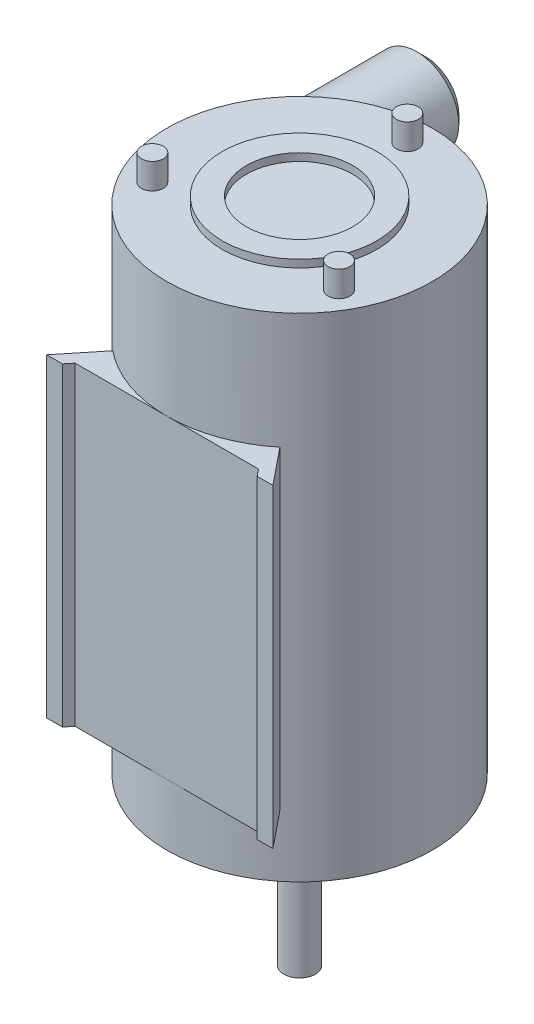
ISO-10303-21;
HEADER;
FILE_DESCRIPTION(('STEP AP214'),'2;1');
FILE_NAME('part.step','',(''),(''),'','','');
FILE_SCHEMA(('AUTOMOTIVE_DESIGN { 1 0 10303 214 1 1 1 1 }'));
ENDSEC;
DATA;
#1=APPLICATION_CONTEXT('core data for automotive mechanical design processes');
#2=APPLICATION_PROTOCOL_DEFINITION('international standard','automotive_design',2000,#1);
#3=PRODUCT_CONTEXT('',#1,'mechanical');
#4=PRODUCT('Part','Part','',(#3));
#5=PRODUCT_RELATED_PRODUCT_CATEGORY('part','',(#4));
#6=PRODUCT_DEFINITION_FORMATION('','',#4);
#7=PRODUCT_DEFINITION_CONTEXT('part definition',#1,'design');
#8=PRODUCT_DEFINITION('design','',#6,#7);
#9=PRODUCT_DEFINITION_SHAPE('','',#8);
#10=(LENGTH_UNIT() NAMED_UNIT(*) SI_UNIT(.MILLI.,.METRE.));
#11=(NAMED_UNIT(*) PLANE_ANGLE_UNIT() SI_UNIT($,.RADIAN.));
#12=(NAMED_UNIT(*) SI_UNIT($,.STERADIAN.) SOLID_ANGLE_UNIT());
#13=UNCERTAINTY_MEASURE_WITH_UNIT(LENGTH_MEASURE(1.E-05),#10,'distance_accuracy_value','');
#14=(GEOMETRIC_REPRESENTATION_CONTEXT(3) GLOBAL_UNCERTAINTY_ASSIGNED_CONTEXT((#13)) GLOBAL_UNIT_ASSIGNED_CONTEXT((#10,
#11,#12)) REPRESENTATION_CONTEXT('',''));
#15=CARTESIAN_POINT('',(0.,0.,0.));
#16=DIRECTION('',(0.,0.,1.));
#17=DIRECTION('',(1.,0.,0.));
#18=AXIS2_PLACEMENT_3D('',#15,#16,#17);
#19=CARTESIAN_POINT('',(0.,42.9514,0.));
#20=DIRECTION('',(0.,-1.,0.));
#21=DIRECTION('',(0.,0.,-1.));
#22=AXIS2_PLACEMENT_3D('',#19,#20,#21);
#23=CYLINDRICAL_SURFACE('',#22,11.5824);
#24=CARTESIAN_POINT('',(0.,0.,0.));
#25=DIRECTION('',(0.,1.,0.));
#26=DIRECTION('',(0.,0.,1.));
#27=AXIS2_PLACEMENT_3D('',#24,#25,#26);
#28=CIRCLE('',#27,11.5824);
#29=CARTESIAN_POINT('',(0.,0.,11.5824));
#30=VERTEX_POINT('',#29);
#31=EDGE_CURVE('E215',#30,#30,#28,.T.);
#32=ORIENTED_EDGE('',*,*,#31,.T.);
#33=EDGE_LOOP('',(#32));
#34=FACE_BOUND('',#33,.T.);
#35=CARTESIAN_POINT('',(0.,42.9514,0.));
#36=DIRECTION('',(0.,1.,0.));
#37=DIRECTION('',(0.,0.,1.));
#38=AXIS2_PLACEMENT_3D('',#35,#36,#37);
#39=CIRCLE('',#38,11.5824);
#40=CARTESIAN_POINT('',(0.,42.9514,11.5824));
#41=VERTEX_POINT('',#40);
#42=EDGE_CURVE('E218',#41,#41,#39,.T.);
#43=ORIENTED_EDGE('',*,*,#42,.F.);
#44=EDGE_LOOP('',(#43));
#45=FACE_BOUND('',#44,.T.);
#46=CARTESIAN_POINT('',(-11.5824,37.8333,0.));
#47=CARTESIAN_POINT('',(-11.5824,37.8331410786259,-3.20483130011963E-08));
#48=CARTESIAN_POINT('',(-11.5823999896922,37.8329821574103,-0.000467474998459455));
#49=CARTESIAN_POINT('',(-11.5823999328128,37.8325434634291,-0.00151313843494728));
#50=CARTESIAN_POINT('',(-11.5823998646313,37.8322636561148,-0.00190545675784335));
#51=CARTESIAN_POINT('',(-11.5823994862447,37.8312069866466,-0.00353191152183258));
#52=CARTESIAN_POINT('',(-11.5823989612629,37.8304309649032,-0.00502251146221884));
#53=CARTESIAN_POINT('',(-11.5823959007933,37.8273515794137,-0.0107869069694098));
#54=CARTESIAN_POINT('',(-11.5823914418426,37.8250464647481,-0.0147679166288982));
#55=CARTESIAN_POINT('',(-11.5822288004094,37.76849372382,-0.112627852863299));
#56=CARTESIAN_POINT('',(-11.5808707872837,37.7142720480142,-0.210776622957327));
#57=CARTESIAN_POINT('',(-11.5757170957593,37.6052015608214,-0.405996049577173));
#58=CARTESIAN_POINT('',(-11.5718907833348,37.5503534974678,-0.503037339912126));
#59=CARTESIAN_POINT('',(-11.5619524357871,37.4428013702579,-0.694161523822879));
#60=CARTESIAN_POINT('',(-11.5559288140794,37.3900920398682,-0.788223297303058));
#61=CARTESIAN_POINT('',(-11.5416068184324,37.2850458226435,-0.975807966923859));
#62=CARTESIAN_POINT('',(-11.533316137801,37.2327082796094,-1.06933161248621));
#63=CARTESIAN_POINT('',(-11.5134651151431,37.1228773422826,-1.26603167995885));
#64=CARTESIAN_POINT('',(-11.5016548413155,37.0654121936926,-1.36920322384356));
#65=CARTESIAN_POINT('',(-11.4752188415015,36.9508340328436,-1.57549282892708));
#66=CARTESIAN_POINT('',(-11.4605904784548,36.893721402529,-1.67861074860376));
#67=CARTESIAN_POINT('',(-11.4122040695874,36.7221881901317,-1.98942073873419));
#68=CARTESIAN_POINT('',(-11.3741141856428,36.6085181185766,-2.19687936581382));
#69=CARTESIAN_POINT('',(-11.2960413889962,36.4089278085072,-2.56486518634621));
#70=CARTESIAN_POINT('',(-11.258356905322,36.3224503766094,-2.72558447280558));
#71=CARTESIAN_POINT('',(-11.1759260775465,36.151781950282,-3.04597564687935));
#72=CARTESIAN_POINT('',(-11.1311948457691,36.0675865047645,-3.20564903121161));
#73=CARTESIAN_POINT('',(-11.0354153111138,35.9033071955223,-3.5211156519997));
#74=CARTESIAN_POINT('',(-10.9845025202835,35.8231756820318,-3.67692514833242));
#75=CARTESIAN_POINT('',(-10.8755726236105,35.6657910604824,-3.98760835044009));
#76=CARTESIAN_POINT('',(-10.8175522853325,35.5885392830831,-4.14248159656859));
#77=CARTESIAN_POINT('',(-10.671732467684,35.4098171160829,-4.50750663692222));
#78=CARTESIAN_POINT('',(-10.5808050440738,35.3098286305439,-4.7171485325879));
#79=CARTESIAN_POINT('',(-10.3846970823118,35.1173609853325,-5.13453561989126));
#80=CARTESIAN_POINT('',(-10.2794554990478,35.0249168597014,-5.34226838183193));
#81=CARTESIAN_POINT('',(-10.049925882779,34.8461861193908,-5.76287952824733));
#82=CARTESIAN_POINT('',(-9.9250207026139,34.7603250875381,-5.97560413551747));
#83=CARTESIAN_POINT('',(-9.65954330625288,34.6019850292102,-6.39584734922412));
#84=CARTESIAN_POINT('',(-9.51899350292674,34.5294872440925,-6.60337289448355));
#85=CARTESIAN_POINT('',(-9.26466075610609,34.4193602557928,-6.95345310762538));
#86=CARTESIAN_POINT('',(-9.15476428884643,34.377694292249,-7.09756916314025));
#87=CARTESIAN_POINT('',(-8.92698075185315,34.3040722268045,-7.38201837650292));
#88=CARTESIAN_POINT('',(-8.80909196448527,34.2721182202485,-7.52235071207413));
#89=CARTESIAN_POINT('',(-8.5668707383494,34.2197732533539,-7.79704492267042));
#90=CARTESIAN_POINT('',(-8.44261532107615,34.1992688713201,-7.93145275374778));
#91=CARTESIAN_POINT('',(-8.18715030536964,34.1710668523911,-8.19488763319112));
#92=CARTESIAN_POINT('',(-8.05594328464715,34.1633645022226,-8.32391664479119));
#93=CARTESIAN_POINT('',(-7.82197186395337,34.1627510961899,-8.54327005843453));
#94=CARTESIAN_POINT('',(-7.72055338897127,34.166550306029,-8.6350266800384));
#95=CARTESIAN_POINT('',(-7.51495235129553,34.1830935350584,-8.81453846884919));
#96=CARTESIAN_POINT('',(-7.41077046875987,34.1958353724987,-8.9022946065017));
#97=CARTESIAN_POINT('',(-7.20028086225053,34.2311045060211,-9.07338724584633));
#98=CARTESIAN_POINT('',(-7.09397140707771,34.2536401080587,-9.15671992860381));
#99=CARTESIAN_POINT('',(-6.88028623384751,34.3092903028029,-9.31834657816679));
#100=CARTESIAN_POINT('',(-6.7729107086706,34.3424030144452,-9.39664143794117));
#101=CARTESIAN_POINT('',(-6.5771692762816,34.4130798776376,-9.53438732440273));
#102=CARTESIAN_POINT('',(-6.48877876659543,34.4488391451143,-9.59473190979402));
#103=CARTESIAN_POINT('',(-6.31290083100473,34.5283080537076,-9.71135413899107));
#104=CARTESIAN_POINT('',(-6.22541323366966,34.5720161551489,-9.76763256745971));
#105=CARTESIAN_POINT('',(-6.05224429264291,34.6675748326344,-9.87586724068644));
#106=CARTESIAN_POINT('',(-5.9665626114732,34.7194238717729,-9.927824298438));
#107=CARTESIAN_POINT('',(-5.79801244279539,34.8313071250351,-10.0271934373396));
#108=CARTESIAN_POINT('',(-5.71514260341236,34.8913373341324,-10.0746077231447));
#109=CARTESIAN_POINT('',(-5.55267976250416,35.0199319493973,-10.1650597286582));
#110=CARTESIAN_POINT('',(-5.47311178965261,35.0885496969796,-10.20806673614));
#111=CARTESIAN_POINT('',(-5.3189485857992,35.2337094491235,-10.2892353276601));
#112=CARTESIAN_POINT('',(-5.24435114631475,35.3102478952815,-10.3273990705446));
#113=CARTESIAN_POINT('',(-5.10114367707827,35.4708431294008,-10.3988812493725));
#114=CARTESIAN_POINT('',(-5.03253419622434,35.5549006051817,-10.4321992413067));
#115=CARTESIAN_POINT('',(-4.90231654892023,35.7299219341293,-10.4940211463595));
#116=CARTESIAN_POINT('',(-4.84070765352814,35.8208850665902,-10.5225255608464));
#117=CARTESIAN_POINT('',(-4.73143176313561,35.9991217526498,-10.5720744447647));
#118=CARTESIAN_POINT('',(-4.68298050550192,36.0857858098719,-10.5935873710517));
#119=CARTESIAN_POINT('',(-4.59296750070936,36.2634652205691,-10.632923120055));
#120=CARTESIAN_POINT('',(-4.5514080299801,36.3544819990544,-10.6507447239709));
#121=CARTESIAN_POINT('',(-4.47571112146949,36.5400970230903,-10.682775354154));
#122=CARTESIAN_POINT('',(-4.44156911918304,36.6346930237595,-10.6969866030512));
#123=CARTESIAN_POINT('',(-4.38105720633174,36.8268277391784,-10.7219121493119));
#124=CARTESIAN_POINT('',(-4.35469011939231,36.9243675088787,-10.7326251763732));
#125=CARTESIAN_POINT('',(-4.31105943246823,37.1171120306731,-10.7502225154422));
#126=CARTESIAN_POINT('',(-4.29343706756056,37.2122219287774,-10.7572584904209));
#127=CARTESIAN_POINT('',(-4.26573879093922,37.4037436983115,-10.7682721108081));
#128=CARTESIAN_POINT('',(-4.25566557172293,37.5001560217984,-10.7722486650493));
#129=CARTESIAN_POINT('',(-4.24318488864621,37.693514290786,-10.7771712794774));
#130=CARTESIAN_POINT('',(-4.24077388964157,37.7904599695231,-10.7781187372098));
#131=CARTESIAN_POINT('',(-4.24362197346659,37.9842307593888,-10.7769963371448));
#132=CARTESIAN_POINT('',(-4.24888387922392,38.0810558130194,-10.7749253688426));
#133=CARTESIAN_POINT('',(-4.27598330891198,38.3685386068995,-10.7642203204334));
#134=CARTESIAN_POINT('',(-4.30901401363646,38.5581215910341,-10.7511423053745));
#135=CARTESIAN_POINT('',(-4.40380006272765,38.9285329684151,-10.712660479374));
#136=CARTESIAN_POINT('',(-4.46555389837148,39.1093618209338,-10.687257315825));
#137=CARTESIAN_POINT('',(-4.61540813924753,39.4577812650926,-10.6233993470305));
#138=CARTESIAN_POINT('',(-4.70356669818471,39.6253415934698,-10.5849157078865));
#139=CARTESIAN_POINT('',(-4.90244230476974,39.9423491621891,-10.494281384897));
#140=CARTESIAN_POINT('',(-5.01315906352933,40.0917966344517,-10.4421308760719));
#141=CARTESIAN_POINT('',(-5.25475431197395,40.3718961819416,-10.3226931867758));
#142=CARTESIAN_POINT('',(-5.38597736633193,40.5021349509286,-10.2551360312942));
#143=CARTESIAN_POINT('',(-5.6614380560318,40.7382193935935,-10.1056736678682));
#144=CARTESIAN_POINT('',(-5.80567688543113,40.8440628260892,-10.0237671428731));
#145=CARTESIAN_POINT('',(-6.11128226884684,41.0368760896515,-9.84062725553677));
#146=CARTESIAN_POINT('',(-6.27315274380931,41.1221725098209,-9.73848385325545));
#147=CARTESIAN_POINT('',(-6.59963743548272,41.2655574939785,-9.52026044805214));
#148=CARTESIAN_POINT('',(-6.7642541712179,41.3236194745398,-9.40416696675017));
#149=CARTESIAN_POINT('',(-7.04502815159516,41.401790812232,-9.19462169203145));
#150=CARTESIAN_POINT('',(-7.16172082727186,41.4279900217903,-9.10405492461627));
#151=CARTESIAN_POINT('',(-7.39280300652162,41.4685706138352,-8.91742656273941));
#152=CARTESIAN_POINT('',(-7.50719170106958,41.482947913365,-8.82136308210834));
#153=CARTESIAN_POINT('',(-7.73251611014057,41.5009451134722,-8.62453227650041));
#154=CARTESIAN_POINT('',(-7.84345454959783,41.5045737281977,-8.52376882923171));
#155=CARTESIAN_POINT('',(-8.0612903814117,41.5021843679672,-8.31805552942978));
#156=CARTESIAN_POINT('',(-8.16818660986958,41.4961636359407,-8.21310448874715));
#157=CARTESIAN_POINT('',(-8.41951170971083,41.4713452226654,-7.95661477013022));
#158=CARTESIAN_POINT('',(-8.56174277239555,41.4483823682068,-7.80331701535294));
#159=CARTESIAN_POINT('',(-8.83641465103728,41.3880897646642,-7.49086741396018));
#160=CARTESIAN_POINT('',(-8.96885081049268,41.3507532340026,-7.33171283616905));
#161=CARTESIAN_POINT('',(-9.22523749872154,41.2633672633303,-7.00645710801893));
#162=CARTESIAN_POINT('',(-9.34904843498388,41.2131521311489,-6.84029098820371));
#163=CARTESIAN_POINT('',(-9.58601838834838,41.1022760350148,-6.50404127042635));
#164=CARTESIAN_POINT('',(-9.6991805593563,41.0416181790988,-6.33395885107082));
#165=CARTESIAN_POINT('',(-9.97113511966823,40.8776704930244,-5.90114483106535));
#166=CARTESIAN_POINT('',(-10.123038330324,40.7686189860558,-5.63624680097659));
#167=CARTESIAN_POINT('',(-10.4033477551472,40.5348111966702,-5.10039298462711));
#168=CARTESIAN_POINT('',(-10.5317060382833,40.410023732279,-4.82942607419414));
#169=CARTESIAN_POINT('',(-10.7588053585256,40.1559584447645,-4.29868224937263));
#170=CARTESIAN_POINT('',(-10.8588038202476,40.0273251022186,-4.03913019881006));
#171=CARTESIAN_POINT('',(-11.03833474078,39.7628445430532,-3.51886456617866));
#172=CARTESIAN_POINT('',(-11.1179901697736,39.627046962715,-3.25816814568277));
#173=CARTESIAN_POINT('',(-11.2169433847358,39.4311769274171,-2.88870670625955));
#174=CARTESIAN_POINT('',(-11.2441940451281,39.3735218188652,-2.7807264738347));
#175=CARTESIAN_POINT('',(-11.2954638488108,39.2573712920559,-2.56453133766616));
#176=CARTESIAN_POINT('',(-11.3194848987203,39.1988763923517,-2.45631661104375));
#177=CARTESIAN_POINT('',(-11.3647988232557,39.079937484168,-2.23742775531914));
#178=CARTESIAN_POINT('',(-11.3860260865003,39.0194780523952,-2.12674846796452));
#179=CARTESIAN_POINT('',(-11.4252321916651,38.8977718528132,-1.90493292543718));
#180=CARTESIAN_POINT('',(-11.4432040121379,38.8365236813242,-1.79379619909036));
#181=CARTESIAN_POINT('',(-11.4807947977942,38.6949179527249,-1.53777872037476));
#182=CARTESIAN_POINT('',(-11.4992742235773,38.6143713137421,-1.39283568518828));
#183=CARTESIAN_POINT('',(-11.5305753716321,38.4533078362543,-1.10395997528484));
#184=CARTESIAN_POINT('',(-11.5434448080847,38.3727968070425,-0.96002945031763));
#185=CARTESIAN_POINT('',(-11.558220766633,38.255512395522,-0.750875154310365));
#186=CARTESIAN_POINT('',(-11.5622731975815,38.2189063371931,-0.685667990980199));
#187=CARTESIAN_POINT('',(-11.5692838062812,38.1455059542578,-0.554908245888196));
#188=CARTESIAN_POINT('',(-11.5722382925815,38.108711408777,-0.489355237169141));
#189=CARTESIAN_POINT('',(-11.5771258598652,38.0336831066712,-0.356169456974038));
#190=CARTESIAN_POINT('',(-11.5790161237546,37.9954475068114,-0.288551704006747));
#191=CARTESIAN_POINT('',(-11.5815838916089,37.919433346841,-0.152551136047128));
#192=CARTESIAN_POINT('',(-11.5822761122174,37.8816549855385,-0.0841881399907458));
#193=CARTESIAN_POINT('',(-11.5823914401503,37.8415541420661,-0.0147672648132497));
#194=CARTESIAN_POINT('',(-11.5823958984871,37.8392496141574,-0.0107887776095065));
#195=CARTESIAN_POINT('',(-11.5823989602959,37.8361703892211,-0.00502494041187211));
#196=CARTESIAN_POINT('',(-11.582399485814,37.8353939332067,-0.00353339017840652));
#197=CARTESIAN_POINT('',(-11.5823998645411,37.8343367003062,-0.00190613368188735));
#198=CARTESIAN_POINT('',(-11.5823999327756,37.8340567656206,-0.00151367119608624));
#199=CARTESIAN_POINT('',(-11.5823999896878,37.8336179101951,-0.000467544717722408));
#200=CARTESIAN_POINT('',(-11.5824,37.8334589550183,3.20550977442486E-08));
#201=CARTESIAN_POINT('',(-11.5824,37.8333,0.));
#202=B_SPLINE_CURVE_WITH_KNOTS('',3,(#46,#47,#48,#49,#50,#51,#52,#53,#54,#55,#56,#57,#58,#59,
#60,#61,#62,#63,#64,#65,#66,#67,#68,#69,#70,#71,#72,#73,#74,#75,#76,#77,#78,#79,#80,#81,#82,#83,
#84,#85,#86,#87,#88,#89,#90,#91,#92,#93,#94,#95,#96,#97,#98,#99,#100,#101,#102,#103,#104,#105,
#106,#107,#108,#109,#110,#111,#112,#113,#114,#115,#116,#117,#118,#119,#120,#121,#122,#123,#124,
#125,#126,#127,#128,#129,#130,#131,#132,#133,#134,#135,#136,#137,#138,#139,#140,#141,#142,#143,
#144,#145,#146,#147,#148,#149,#150,#151,#152,#153,#154,#155,#156,#157,#158,#159,#160,#161,#162,
#163,#164,#165,#166,#167,#168,#169,#170,#171,#172,#173,#174,#175,#176,#177,#178,#179,#180,#181,
#182,#183,#184,#185,#186,#187,#188,#189,#190,#191,#192,#193,#194,#195,#196,#197,#198,#199,#200,
#201),.UNSPECIFIED.,.T.,.F.,(4,2,2,2,2,2,2,2,2,2,2,2,2,2,2,2,2,2,2,2,2,2,2,2,2,2,2,2,2,2,2,2,2,
2,2,2,2,2,2,2,2,2,2,2,2,2,2,2,2,2,2,2,2,2,2,2,2,2,2,2,2,2,2,2,2,2,2,2,2,2,2,2,2,2,2,2,2,4),(0.,
0.000971375526649749,0.00268115523079775,0.00743110704150046,0.0215243187059784,
0.353195241842484,0.689063854696616,1.01268806933528,1.33522740369485,1.69121892031791,
2.04754519270814,2.76602346892034,3.32496309149414,3.88271994390188,4.42992537476159,
4.97738059910166,5.72516339887951,6.47624154386271,7.25907475108458,8.04080054614613,
8.5982926302744,9.15590490750066,9.7078906860644,10.2596731971568,10.6697950838093,
11.0798169469999,11.4901872246966,11.9004845615325,12.238678363359,12.5768067272672,
12.914871333416,13.2527710332689,13.5928847555193,13.9328463383172,14.2728390517086,
14.6127963305659,14.9171899975202,15.2216840094879,15.5259901101481,15.8304065902937,
16.1210110277117,16.4117190635798,16.7022929550206,16.9929737780726,17.5686429666312,
18.1442819207693,18.7211981016256,19.2981068947541,19.8860298009781,20.4740066977482,
21.1001919717216,21.7269871971904,22.1764748915542,22.6261177612598,23.075395997669,
23.5248026274914,24.154973461484,24.785441978561,25.4244688268967,26.0633058113449,
27.0344961374319,28.0076421157938,28.9262030730633,29.8390725400849,30.2152560709068,
30.5912165352318,30.9748425378722,31.3592863537447,31.8597434472934,32.3558567984449,
32.5805716202401,32.8060352736514,33.0400190051055,33.2711075459415,33.2851971088741,
33.2899497269115,33.2916602834785,33.2926318646488),.UNSPECIFIED.);
#203=CARTESIAN_POINT('',(-11.5824,37.8333,0.));
#204=VERTEX_POINT('',#203);
#205=EDGE_CURVE('E64',#204,#204,#202,.T.);
#206=ORIENTED_EDGE('',*,*,#205,.T.);
#207=EDGE_LOOP('',(#206));
#208=FACE_BOUND('',#207,.T.);
#209=CARTESIAN_POINT('',(0.,5.3594,0.));
#210=DIRECTION('',(0.,1.,0.));
#211=DIRECTION('',(0.,0.,1.));
#212=AXIS2_PLACEMENT_3D('',#209,#210,#211);
#213=CIRCLE('',#212,11.5824);
#214=CARTESIAN_POINT('',(0.,5.3594,11.5824));
#215=VERTEX_POINT('',#214);
#216=CARTESIAN_POINT('',(7.28592140878282,5.3594,9.00374027752024));
#217=VERTEX_POINT('',#216);
#218=EDGE_CURVE('E11',#215,#217,#213,.T.);
#219=ORIENTED_EDGE('',*,*,#218,.F.);
#220=CARTESIAN_POINT('',(-7.28592140878282,5.3594,9.00374027752024));
#221=VERTEX_POINT('',#220);
#222=EDGE_CURVE('E47',#221,#215,#213,.T.);
#223=ORIENTED_EDGE('',*,*,#222,.F.);
#224=DIRECTION('',(0.,-1.,0.));
#225=VECTOR('',#224,1.);
#226=CARTESIAN_POINT('',(-7.28592140878282,42.9514,9.00374027752024));
#227=LINE('',#226,#225);
#228=CARTESIAN_POINT('',(-7.28592140878282,32.7914,9.00374027752024));
#229=VERTEX_POINT('',#228);
#230=EDGE_CURVE('E142',#229,#221,#227,.T.);
#231=ORIENTED_EDGE('',*,*,#230,.F.);
#232=CARTESIAN_POINT('',(0.,32.7914,0.));
#233=DIRECTION('',(0.,1.,0.));
#234=DIRECTION('',(0.,0.,1.));
#235=AXIS2_PLACEMENT_3D('',#232,#233,#234);
#236=CIRCLE('',#235,11.5824);
#237=CARTESIAN_POINT('',(0.,32.7914,11.5824));
#238=VERTEX_POINT('',#237);
#239=EDGE_CURVE('E335',#229,#238,#236,.T.);
#240=ORIENTED_EDGE('',*,*,#239,.T.);
#241=CARTESIAN_POINT('',(7.28592140878282,32.7914,9.00374027752024));
#242=VERTEX_POINT('',#241);
#243=EDGE_CURVE('E338',#238,#242,#236,.T.);
#244=ORIENTED_EDGE('',*,*,#243,.T.);
#245=DIRECTION('',(0.,-1.,0.));
#246=VECTOR('',#245,1.);
#247=CARTESIAN_POINT('',(7.28592140878282,42.9514,9.00374027752024));
#248=LINE('',#247,#246);
#249=EDGE_CURVE('E339',#242,#217,#248,.T.);
#250=ORIENTED_EDGE('',*,*,#249,.T.);
#251=EDGE_LOOP('',(#219,#223,#231,#240,#244,#250));
#252=FACE_BOUND('',#251,.T.);
#253=ADVANCED_FACE('F42',(#34,#45,#208,#252),#23,.T.);
#254=CARTESIAN_POINT('',(0.,42.9514,0.));
#255=DIRECTION('',(0.,1.,0.));
#256=DIRECTION('',(0.,0.,1.));
#257=AXIS2_PLACEMENT_3D('',#254,#255,#256);
#258=PLANE('',#257);
#259=CARTESIAN_POINT('',(8.1389067447662,42.9514,4.69899999999992));
#260=DIRECTION('',(0.,1.,0.));
#261=DIRECTION('',(-0.866025403784443,0.,-0.499999999999992));
#262=AXIS2_PLACEMENT_3D('',#259,#260,#261);
#263=CIRCLE('',#262,0.9525);
#264=CARTESIAN_POINT('',(7.31401754766152,42.9514,4.22274999999993));
#265=VERTEX_POINT('',#264);
#266=EDGE_CURVE('E194',#265,#265,#263,.T.);
#267=ORIENTED_EDGE('',*,*,#266,.F.);
#268=EDGE_LOOP('',(#267));
#269=FACE_BOUND('',#268,.T.);
#270=CARTESIAN_POINT('',(-8.13890674476613,42.9514,4.69900000000004));
#271=DIRECTION('',(0.,1.,0.));
#272=DIRECTION('',(0.866025403784436,0.,-0.500000000000004));
#273=AXIS2_PLACEMENT_3D('',#270,#271,#272);
#274=CIRCLE('',#273,0.9525);
#275=CARTESIAN_POINT('',(-7.31401754766146,42.9514,4.22275000000004));
#276=VERTEX_POINT('',#275);
#277=EDGE_CURVE('E193',#276,#276,#274,.T.);
#278=ORIENTED_EDGE('',*,*,#277,.F.);
#279=EDGE_LOOP('',(#278));
#280=FACE_BOUND('',#279,.T.);
#281=CARTESIAN_POINT('',(0.,42.9514,-9.398));
#282=DIRECTION('',(0.,1.,0.));
#283=DIRECTION('',(0.,0.,1.));
#284=AXIS2_PLACEMENT_3D('',#281,#282,#283);
#285=CIRCLE('',#284,0.9525);
#286=CARTESIAN_POINT('',(0.,42.9514,-8.4455));
#287=VERTEX_POINT('',#286);
#288=EDGE_CURVE('E200',#287,#287,#285,.T.);
#289=ORIENTED_EDGE('',*,*,#288,.F.);
#290=EDGE_LOOP('',(#289));
#291=FACE_BOUND('',#290,.T.);
#292=CARTESIAN_POINT('',(0.,42.9514,0.));
#293=DIRECTION('',(0.,1.,0.));
#294=DIRECTION('',(0.,0.,1.));
#295=AXIS2_PLACEMENT_3D('',#292,#293,#294);
#296=CIRCLE('',#295,6.7437);
#297=CARTESIAN_POINT('',(0.,42.9514,6.7437));
#298=VERTEX_POINT('',#297);
#299=EDGE_CURVE('E211',#298,#298,#296,.T.);
#300=ORIENTED_EDGE('',*,*,#299,.F.);
#301=EDGE_LOOP('',(#300));
#302=FACE_BOUND('',#301,.T.);
#303=ORIENTED_EDGE('',*,*,#42,.T.);
#304=EDGE_LOOP('',(#303));
#305=FACE_BOUND('',#304,.T.);
#306=ADVANCED_FACE('F297',(#269,#280,#291,#302,#305),#258,.T.);
#307=CARTESIAN_POINT('',(0.,0.,0.));
#308=DIRECTION('',(0.,1.,0.));
#309=DIRECTION('',(0.,0.,1.));
#310=AXIS2_PLACEMENT_3D('',#307,#308,#309);
#311=PLANE('',#310);
#312=CARTESIAN_POINT('',(4.318,0.,4.318));
#313=DIRECTION('',(0.,1.,0.));
#314=DIRECTION('',(0.,0.,1.));
#315=AXIS2_PLACEMENT_3D('',#312,#313,#314);
#316=CIRCLE('',#315,1.36525);
#317=CARTESIAN_POINT('',(4.318,0.,5.68325));
#318=VERTEX_POINT('',#317);
#319=EDGE_CURVE('E330',#318,#318,#316,.F.);
#320=ORIENTED_EDGE('',*,*,#319,.F.);
#321=EDGE_LOOP('',(#320));
#322=FACE_BOUND('',#321,.T.);
#323=ORIENTED_EDGE('',*,*,#31,.F.);
#324=EDGE_LOOP('',(#323));
#325=FACE_BOUND('',#324,.T.);
#326=ADVANCED_FACE('F292',(#322,#325),#311,.F.);
#327=CARTESIAN_POINT('',(0.,43.6118,0.));
#328=DIRECTION('',(0.,1.,0.));
#329=DIRECTION('',(0.,0.,1.));
#330=AXIS2_PLACEMENT_3D('',#327,#328,#329);
#331=PLANE('',#330);
#332=CARTESIAN_POINT('',(0.,43.6118,0.));
#333=DIRECTION('',(0.,1.,0.));
#334=DIRECTION('',(0.,0.,1.));
#335=AXIS2_PLACEMENT_3D('',#332,#333,#334);
#336=CIRCLE('',#335,6.7437);
#337=CARTESIAN_POINT('',(0.,43.6118,6.7437));
#338=VERTEX_POINT('',#337);
#339=EDGE_CURVE('E212',#338,#338,#336,.T.);
#340=ORIENTED_EDGE('',*,*,#339,.T.);
#341=EDGE_LOOP('',(#340));
#342=FACE_BOUND('',#341,.T.);
#343=CARTESIAN_POINT('',(0.,43.6118,0.));
#344=DIRECTION('',(0.,1.,0.));
#345=DIRECTION('',(0.,0.,1.));
#346=AXIS2_PLACEMENT_3D('',#343,#344,#345);
#347=CIRCLE('',#346,4.6355);
#348=CARTESIAN_POINT('',(0.,43.6118,4.6355));
#349=VERTEX_POINT('',#348);
#350=EDGE_CURVE('E206',#349,#349,#347,.T.);
#351=ORIENTED_EDGE('',*,*,#350,.F.);
#352=EDGE_LOOP('',(#351));
#353=FACE_BOUND('',#352,.T.);
#354=ADVANCED_FACE('F289',(#342,#353),#331,.T.);
#355=CARTESIAN_POINT('',(0.,43.6118,0.));
#356=DIRECTION('',(0.,-1.,0.));
#357=DIRECTION('',(0.,0.,-1.));
#358=AXIS2_PLACEMENT_3D('',#355,#356,#357);
#359=CYLINDRICAL_SURFACE('',#358,6.7437);
#360=ORIENTED_EDGE('',*,*,#339,.F.);
#361=EDGE_LOOP('',(#360));
#362=FACE_BOUND('',#361,.T.);
#363=ORIENTED_EDGE('',*,*,#299,.T.);
#364=EDGE_LOOP('',(#363));
#365=FACE_BOUND('',#364,.T.);
#366=ADVANCED_FACE('F287',(#362,#365),#359,.T.);
#367=CARTESIAN_POINT('',(0.,43.6118,0.));
#368=DIRECTION('',(0.,-1.,0.));
#369=DIRECTION('',(0.,0.,-1.));
#370=AXIS2_PLACEMENT_3D('',#367,#368,#369);
#371=CYLINDRICAL_SURFACE('',#370,4.6355);
#372=ORIENTED_EDGE('',*,*,#350,.T.);
#373=EDGE_LOOP('',(#372));
#374=FACE_BOUND('',#373,.T.);
#375=CARTESIAN_POINT('',(0.,42.9514,0.));
#376=DIRECTION('',(0.,1.,0.));
#377=DIRECTION('',(0.,0.,1.));
#378=AXIS2_PLACEMENT_3D('',#375,#376,#377);
#379=CIRCLE('',#378,4.6355);
#380=CARTESIAN_POINT('',(0.,42.9514,4.6355));
#381=VERTEX_POINT('',#380);
#382=EDGE_CURVE('E221',#381,#381,#379,.F.);
#383=ORIENTED_EDGE('',*,*,#382,.T.);
#384=EDGE_LOOP('',(#383));
#385=FACE_BOUND('',#384,.T.);
#386=ADVANCED_FACE('F284',(#374,#385),#371,.F.);
#387=ORIENTED_EDGE('',*,*,#382,.F.);
#388=EDGE_LOOP('',(#387));
#389=FACE_BOUND('',#388,.T.);
#390=ADVANCED_FACE('F282',(#389),#258,.T.);
#391=CARTESIAN_POINT('',(0.,45.1866,-9.398));
#392=DIRECTION('',(0.,-1.,0.));
#393=DIRECTION('',(0.,0.,-1.));
#394=AXIS2_PLACEMENT_3D('',#391,#392,#393);
#395=CYLINDRICAL_SURFACE('',#394,0.9525);
#396=CARTESIAN_POINT('',(0.,45.1866,-9.398));
#397=DIRECTION('',(0.,1.,0.));
#398=DIRECTION('',(0.,0.,1.));
#399=AXIS2_PLACEMENT_3D('',#396,#397,#398);
#400=CIRCLE('',#399,0.9525);
#401=CARTESIAN_POINT('',(0.,45.1866,-8.4455));
#402=VERTEX_POINT('',#401);
#403=EDGE_CURVE('E203',#402,#402,#400,.T.);
#404=ORIENTED_EDGE('',*,*,#403,.F.);
#405=EDGE_LOOP('',(#404));
#406=FACE_BOUND('',#405,.T.);
#407=ORIENTED_EDGE('',*,*,#288,.T.);
#408=EDGE_LOOP('',(#407));
#409=FACE_BOUND('',#408,.T.);
#410=ADVANCED_FACE('F278',(#406,#409),#395,.T.);
#411=CARTESIAN_POINT('',(0.,45.1866,0.));
#412=DIRECTION('',(0.,1.,0.));
#413=DIRECTION('',(0.,0.,1.));
#414=AXIS2_PLACEMENT_3D('',#411,#412,#413);
#415=PLANE('',#414);
#416=ORIENTED_EDGE('',*,*,#403,.T.);
#417=EDGE_LOOP('',(#416));
#418=FACE_BOUND('',#417,.T.);
#419=ADVANCED_FACE('F274',(#418),#415,.T.);
#420=CARTESIAN_POINT('',(-8.13890674476613,45.1866,4.69900000000004));
#421=DIRECTION('',(0.,-1.,0.));
#422=DIRECTION('',(0.,0.,-1.));
#423=AXIS2_PLACEMENT_3D('',#420,#421,#422);
#424=CYLINDRICAL_SURFACE('',#423,0.9525);
#425=CARTESIAN_POINT('',(-8.13890674476613,45.1866,4.69900000000004));
#426=DIRECTION('',(0.,1.,0.));
#427=DIRECTION('',(0.866025403784436,0.,-0.500000000000004));
#428=AXIS2_PLACEMENT_3D('',#425,#426,#427);
#429=CIRCLE('',#428,0.9525);
#430=CARTESIAN_POINT('',(-7.31401754766146,45.1866,4.22275000000004));
#431=VERTEX_POINT('',#430);
#432=EDGE_CURVE('E197',#431,#431,#429,.T.);
#433=ORIENTED_EDGE('',*,*,#432,.F.);
#434=EDGE_LOOP('',(#433));
#435=FACE_BOUND('',#434,.T.);
#436=ORIENTED_EDGE('',*,*,#277,.T.);
#437=EDGE_LOOP('',(#436));
#438=FACE_BOUND('',#437,.T.);
#439=ADVANCED_FACE('F270',(#435,#438),#424,.T.);
#440=CARTESIAN_POINT('',(0.,45.1866,0.));
#441=DIRECTION('',(0.,1.,0.));
#442=DIRECTION('',(0.866025403784436,0.,-0.500000000000004));
#443=AXIS2_PLACEMENT_3D('',#440,#441,#442);
#444=PLANE('',#443);
#445=ORIENTED_EDGE('',*,*,#432,.T.);
#446=EDGE_LOOP('',(#445));
#447=FACE_BOUND('',#446,.T.);
#448=ADVANCED_FACE('F266',(#447),#444,.T.);
#449=CARTESIAN_POINT('',(8.1389067447662,45.1866,4.69899999999992));
#450=DIRECTION('',(0.,-1.,0.));
#451=DIRECTION('',(0.,0.,-1.));
#452=AXIS2_PLACEMENT_3D('',#449,#450,#451);
#453=CYLINDRICAL_SURFACE('',#452,0.9525);
#454=CARTESIAN_POINT('',(8.1389067447662,45.1866,4.69899999999992));
#455=DIRECTION('',(0.,1.,0.));
#456=DIRECTION('',(-0.866025403784443,0.,-0.499999999999992));
#457=AXIS2_PLACEMENT_3D('',#454,#455,#456);
#458=CIRCLE('',#457,0.9525);
#459=CARTESIAN_POINT('',(7.31401754766152,45.1866,4.22274999999993));
#460=VERTEX_POINT('',#459);
#461=EDGE_CURVE('E190',#460,#460,#458,.T.);
#462=ORIENTED_EDGE('',*,*,#461,.F.);
#463=EDGE_LOOP('',(#462));
#464=FACE_BOUND('',#463,.T.);
#465=ORIENTED_EDGE('',*,*,#266,.T.);
#466=EDGE_LOOP('',(#465));
#467=FACE_BOUND('',#466,.T.);
#468=ADVANCED_FACE('F262',(#464,#467),#453,.T.);
#469=CARTESIAN_POINT('',(0.,45.1866,0.));
#470=DIRECTION('',(0.,1.,0.));
#471=DIRECTION('',(-0.866025403784443,0.,-0.499999999999992));
#472=AXIS2_PLACEMENT_3D('',#469,#470,#471);
#473=PLANE('',#472);
#474=ORIENTED_EDGE('',*,*,#461,.T.);
#475=EDGE_LOOP('',(#474));
#476=FACE_BOUND('',#475,.T.);
#477=ADVANCED_FACE('F258',(#476),#473,.T.);
#478=CARTESIAN_POINT('',(-7.9121,37.8333,-18.923));
#479=DIRECTION('',(0.,0.,1.));
#480=DIRECTION('',(1.,0.,0.));
#481=AXIS2_PLACEMENT_3D('',#478,#479,#480);
#482=CYLINDRICAL_SURFACE('',#481,3.6703);
#483=CARTESIAN_POINT('',(-7.9121,37.8333,-18.12925));
#484=DIRECTION('',(0.,0.,1.));
#485=DIRECTION('',(1.,0.,0.));
#486=AXIS2_PLACEMENT_3D('',#483,#484,#485);
#487=CIRCLE('',#486,3.6703);
#488=CARTESIAN_POINT('',(-4.2418,37.8333,-18.12925));
#489=VERTEX_POINT('',#488);
#490=EDGE_CURVE('E233',#489,#489,#487,.T.);
#491=ORIENTED_EDGE('',*,*,#490,.T.);
#492=EDGE_LOOP('',(#491));
#493=FACE_BOUND('',#492,.T.);
#494=ORIENTED_EDGE('',*,*,#205,.F.);
#495=EDGE_LOOP('',(#494));
#496=FACE_BOUND('',#495,.T.);
#497=ADVANCED_FACE('F248',(#493,#496),#482,.T.);
#498=CARTESIAN_POINT('',(-7.9121,37.8333,-18.923));
#499=DIRECTION('',(0.,0.,1.));
#500=DIRECTION('',(1.,0.,0.));
#501=AXIS2_PLACEMENT_3D('',#498,#499,#500);
#502=CYLINDRICAL_SURFACE('',#501,2.4511);
#503=CARTESIAN_POINT('',(-7.9121,37.8333,-18.923));
#504=DIRECTION('',(0.,0.,1.));
#505=DIRECTION('',(1.,0.,0.));
#506=AXIS2_PLACEMENT_3D('',#503,#504,#505);
#507=CIRCLE('',#506,2.4511);
#508=CARTESIAN_POINT('',(-5.461,37.8333,-18.923));
#509=VERTEX_POINT('',#508);
#510=EDGE_CURVE('E187',#509,#509,#507,.T.);
#511=ORIENTED_EDGE('',*,*,#510,.F.);
#512=EDGE_LOOP('',(#511));
#513=FACE_BOUND('',#512,.T.);
#514=CARTESIAN_POINT('',(-5.461,37.8333,-10.2141797889013));
#515=CARTESIAN_POINT('',(-5.46099419900486,37.9576547990682,-10.2141813824272));
#516=CARTESIAN_POINT('',(-5.47049852144545,38.0819740783305,-10.209118018594));
#517=CARTESIAN_POINT('',(-5.50802481829152,38.3269079115726,-10.1889207190079));
#518=CARTESIAN_POINT('',(-5.53604066732118,38.4475236772166,-10.1737901144454));
#519=CARTESIAN_POINT('',(-5.60917649157864,38.6815004824611,-10.1336492508997));
#520=CARTESIAN_POINT('',(-5.65427305865986,38.7948712035814,-10.1086525109264));
#521=CARTESIAN_POINT('',(-5.7594640216865,39.0116777856157,-10.0490895488494));
#522=CARTESIAN_POINT('',(-5.81956036664166,39.1151123530459,-10.0145220831008));
#523=CARTESIAN_POINT('',(-5.95407108386931,39.3127321802312,-9.93515373575064));
#524=CARTESIAN_POINT('',(-6.02885457597347,39.4065559425493,-9.89008178322999));
#525=CARTESIAN_POINT('',(-6.18838252792761,39.5798909689906,-9.79105326030313));
#526=CARTESIAN_POINT('',(-6.27312927656722,39.659398933784,-9.73709464728047));
#527=CARTESIAN_POINT('',(-6.4583405289792,39.8107144876219,-9.61536617942743));
#528=CARTESIAN_POINT('',(-6.55952913743922,39.8809531038742,-9.54675429499351));
#529=CARTESIAN_POINT('',(-6.76654887131143,40.0035790194634,-9.40116390263548));
#530=CARTESIAN_POINT('',(-6.87238308094423,40.0559542505977,-9.32417978469775));
#531=CARTESIAN_POINT('',(-7.13260344522453,40.1630728634334,-9.12769422946823));
#532=CARTESIAN_POINT('',(-7.28787179506166,40.208727060437,-9.0043842937377));
#533=CARTESIAN_POINT('',(-7.59527002705803,40.2688993004259,-8.74667339728489));
#534=CARTESIAN_POINT('',(-7.74739376775867,40.2833612422984,-8.61225290349804));
#535=CARTESIAN_POINT('',(-7.99354631982751,40.2849942714742,-8.38290741694246));
#536=CARTESIAN_POINT('',(-8.08967999000882,40.2797961466794,-8.29016375995984));
#537=CARTESIAN_POINT('',(-8.27813886895441,40.25876889611,-8.10198267751748));
#538=CARTESIAN_POINT('',(-8.3704627841979,40.2429361906067,-8.00654435536699));
#539=CARTESIAN_POINT('',(-8.55092550505914,40.201502520022,-7.81352446644994));
#540=CARTESIAN_POINT('',(-8.63905575696889,40.1758824780403,-7.71593906702996));
#541=CARTESIAN_POINT('',(-8.81059834614277,40.1155919850213,-7.51946479116961));
#542=CARTESIAN_POINT('',(-8.89401128622255,40.0809226935631,-7.42057608327684));
#543=CARTESIAN_POINT('',(-9.0576655483366,40.0021703860906,-7.21995893880935));
#544=CARTESIAN_POINT('',(-9.13779737899276,39.9578978057123,-7.11821574614913));
#545=CARTESIAN_POINT('',(-9.29270957208896,39.8606570253203,-6.91475872706956));
#546=CARTESIAN_POINT('',(-9.36748844622323,39.8076864203373,-6.81304491658814));
#547=CARTESIAN_POINT('',(-9.51120798244254,39.6931822812998,-6.61091799974713));
#548=CARTESIAN_POINT('',(-9.58016715248693,39.6316776754998,-6.51050170211928));
#549=CARTESIAN_POINT('',(-9.71217021395477,39.499541789926,-6.31188801317026));
#550=CARTESIAN_POINT('',(-9.77521823832532,39.4289169701968,-6.21368910851855));
#551=CARTESIAN_POINT('',(-9.88669915699161,39.2878739547622,-6.03446192871596));
#552=CARTESIAN_POINT('',(-9.93595065662199,39.2187553000453,-5.952925538653));
#553=CARTESIAN_POINT('',(-10.029164096244,39.0716567891191,-5.79450617688631));
#554=CARTESIAN_POINT('',(-10.0731159290204,38.9936605357901,-5.71763223161607));
#555=CARTESIAN_POINT('',(-10.1550165972073,38.8262962434011,-5.57088468281023));
#556=CARTESIAN_POINT('',(-10.1928824254437,38.7367967848892,-5.50111198038868));
#557=CARTESIAN_POINT('',(-10.2596310905749,38.5454392244548,-5.37559019496351));
#558=CARTESIAN_POINT('',(-10.288556586213,38.4436431394704,-5.31977476662008));
#559=CARTESIAN_POINT('',(-10.3237828262441,38.275414067329,-5.25093274626074));
#560=CARTESIAN_POINT('',(-10.334434177778,38.2132105540578,-5.22989454707615));
#561=CARTESIAN_POINT('',(-10.3510007077608,38.085813567804,-5.19702938237809));
#562=CARTESIAN_POINT('',(-10.3569227310684,38.0206245609126,-5.18518910519338));
#563=CARTESIAN_POINT('',(-10.3634745143964,37.8884984885242,-5.17208356347566));
#564=CARTESIAN_POINT('',(-10.3640729454776,37.8215533972736,-5.17088090073859));
#565=CARTESIAN_POINT('',(-10.3598276294832,37.6885246295695,-5.17938015840084));
#566=CARTESIAN_POINT('',(-10.3549801734359,37.6224415712359,-5.18908951053034));
#567=CARTESIAN_POINT('',(-10.3391397569377,37.4824101062794,-5.22058692408615));
#568=CARTESIAN_POINT('',(-10.3272660059201,37.4089592140716,-5.24410120355901));
#569=CARTESIAN_POINT('',(-10.298053353061,37.2672783026899,-5.3012371208743));
#570=CARTESIAN_POINT('',(-10.2807030982714,37.1990594982711,-5.334879748314));
#571=CARTESIAN_POINT('',(-10.2296912896034,37.0277699568564,-5.4323065645979));
#572=CARTESIAN_POINT('',(-10.1925631456941,36.92909227067,-5.50189761443297));
#573=CARTESIAN_POINT('',(-10.1102220312469,36.7440585039898,-5.6517956543513));
#574=CARTESIAN_POINT('',(-10.0649842677101,36.6577417117725,-5.73213530877795));
#575=CARTESIAN_POINT('',(-9.9708509067087,36.5001282590603,-5.89426982181782));
#576=CARTESIAN_POINT('',(-9.92231212649056,36.4282551076024,-5.97571909230741));
#577=CARTESIAN_POINT('',(-9.82020496718925,36.2924399385697,-6.14207682402026));
#578=CARTESIAN_POINT('',(-9.76663242053503,36.2285045963668,-6.22698811801991));
#579=CARTESIAN_POINT('',(-9.65485156015558,36.1077631683388,-6.39893438479221));
#580=CARTESIAN_POINT('',(-9.59663880522381,36.0509640499168,-6.4859713354438));
#581=CARTESIAN_POINT('',(-9.47586941875693,35.9441160295251,-6.66117242631083));
#582=CARTESIAN_POINT('',(-9.4133121264431,35.8940681578014,-6.74933673632001));
#583=CARTESIAN_POINT('',(-9.27862563154817,35.796643369991,-6.93348108643202));
#584=CARTESIAN_POINT('',(-9.20613331290445,35.7498380886053,-7.02949924701036));
#585=CARTESIAN_POINT('',(-9.05644762231443,35.6640141813734,-7.22132868110807));
#586=CARTESIAN_POINT('',(-8.97925355429334,35.6249967121559,-7.31713992180908));
#587=CARTESIAN_POINT('',(-8.74100753919621,35.5200938184956,-7.60316215712161));
#588=CARTESIAN_POINT('',(-8.57305035379946,35.4661825613455,-7.79229458650372));
#589=CARTESIAN_POINT('',(-8.24232885541737,35.3994182941142,-8.1404351629706));
#590=CARTESIAN_POINT('',(-8.0813437057976,35.3824276895479,-8.30034176784103));
#591=CARTESIAN_POINT('',(-7.75004034717317,35.3819775583858,-8.61046065665996));
#592=CARTESIAN_POINT('',(-7.57973260961337,35.3984811325943,-8.76068342079556));
#593=CARTESIAN_POINT('',(-7.27406360509353,35.4627647919159,-9.01500570555301));
#594=CARTESIAN_POINT('',(-7.13940312459322,35.5027263692893,-9.12190772838786));
#595=CARTESIAN_POINT('',(-6.87226137642901,35.6090651757334,-9.32480518476057));
#596=CARTESIAN_POINT('',(-6.73977754646152,35.6754086206693,-9.4208143661433));
#597=CARTESIAN_POINT('',(-6.50440630115915,35.8227721397641,-9.58445334686736));
#598=CARTESIAN_POINT('',(-6.40027015635198,35.8994934034764,-9.6541451467299));
#599=CARTESIAN_POINT('',(-6.20192274679303,36.0724841356087,-9.78274485888209));
#600=CARTESIAN_POINT('',(-6.10770860170762,36.1687479069944,-9.84165590448352));
#601=CARTESIAN_POINT('',(-5.93341610106238,36.3801756099182,-9.94771689421637));
#602=CARTESIAN_POINT('',(-5.8534246406578,36.4954479512102,-9.99479522200583));
#603=CARTESIAN_POINT('',(-5.71298980870553,36.7415786183006,-10.0757308250844));
#604=CARTESIAN_POINT('',(-5.65254256454415,36.8724338493675,-10.1095907198329));
#605=CARTESIAN_POINT('',(-5.55719797524677,37.1393649471456,-10.1623031105617));
#606=CARTESIAN_POINT('',(-5.52130819995988,37.2749698679882,-10.1817416172834));
#607=CARTESIAN_POINT('',(-5.4732182647213,37.551500137242,-10.2076759032966));
#608=CARTESIAN_POINT('',(-5.46100657174152,37.6924228613608,-10.2141779836524));
#609=CARTESIAN_POINT('',(-5.461,37.8333,-10.2141797889013));
#610=B_SPLINE_CURVE_WITH_KNOTS('',3,(#514,#515,#516,#517,#518,#519,#520,#521,#522,#523,#524,
#525,#526,#527,#528,#529,#530,#531,#532,#533,#534,#535,#536,#537,#538,#539,#540,#541,#542,#543,
#544,#545,#546,#547,#548,#549,#550,#551,#552,#553,#554,#555,#556,#557,#558,#559,#560,#561,#562,
#563,#564,#565,#566,#567,#568,#569,#570,#571,#572,#573,#574,#575,#576,#577,#578,#579,#580,#581,
#582,#583,#584,#585,#586,#587,#588,#589,#590,#591,#592,#593,#594,#595,#596,#597,#598,#599,#600,
#601,#602,#603,#604,#605,#606,#607,#608,#609),.UNSPECIFIED.,.T.,.F.,(4,2,2,2,2,2,2,2,2,2,2,2,2,
2,2,2,2,2,2,2,2,2,2,2,2,2,2,2,2,2,2,2,2,2,2,2,2,2,2,2,2,2,2,2,2,2,2,4),(0.,0.372544574381296,
0.744965937232612,1.11687875385336,1.48883992048353,1.87174070192213,2.25472961700617,
2.67607995349449,3.09771438593541,3.70478430280834,4.31294516344524,4.71350481164344,
5.11419936069267,5.51567893808948,5.91710709476285,6.32732813148512,6.73766278427864,
7.14663901723741,7.5553271363415,7.9079760925815,8.26128730538906,8.61906969142147,
8.97511758308098,9.17397059406728,9.37253527654916,9.5722677297302,9.77213629505089,
10.0049284209161,10.2382063364657,10.6150686438347,10.9931033910181,11.3495325977203,
11.7062595451456,12.0633321177526,12.420459118451,12.8073953302982,13.1943889663683,
13.9670465467051,14.6473441140955,15.3268926317226,15.8544949558164,16.3814238066882,
16.8203904330411,17.2592292750761,17.7006634364674,18.1420100756427,18.5642583214775,
18.9863008485663),.UNSPECIFIED.);
#611=CARTESIAN_POINT('',(-5.461,37.8333,-10.2141797889013));
#612=VERTEX_POINT('',#611);
#613=EDGE_CURVE('E226',#612,#612,#610,.T.);
#614=ORIENTED_EDGE('',*,*,#613,.T.);
#615=EDGE_LOOP('',(#614));
#616=FACE_BOUND('',#615,.T.);
#617=ADVANCED_FACE('F242',(#513,#616),#502,.F.);
#618=CARTESIAN_POINT('',(-7.9121,37.8333,-18.923));
#619=DIRECTION('',(0.,0.,1.));
#620=DIRECTION('',(1.,0.,0.));
#621=AXIS2_PLACEMENT_3D('',#618,#619,#620);
#622=PLANE('',#621);
#623=CARTESIAN_POINT('',(-7.9121,37.8333,-18.923));
#624=DIRECTION('',(0.,0.,1.));
#625=DIRECTION('',(1.,0.,0.));
#626=AXIS2_PLACEMENT_3D('',#623,#624,#625);
#627=CIRCLE('',#626,2.87655);
#628=CARTESIAN_POINT('',(-5.03555000000001,37.8333,-18.923));
#629=VERTEX_POINT('',#628);
#630=EDGE_CURVE('E327',#629,#629,#627,.F.);
#631=ORIENTED_EDGE('',*,*,#630,.T.);
#632=EDGE_LOOP('',(#631));
#633=FACE_BOUND('',#632,.T.);
#634=ORIENTED_EDGE('',*,*,#510,.T.);
#635=EDGE_LOOP('',(#634));
#636=FACE_BOUND('',#635,.T.);
#637=ADVANCED_FACE('F247',(#633,#636),#622,.F.);
#638=ORIENTED_EDGE('',*,*,#613,.F.);
#639=EDGE_LOOP('',(#638));
#640=FACE_BOUND('',#639,.T.);
#641=ADVANCED_FACE('F253',(#640),#23,.T.);
#642=CARTESIAN_POINT('',(-7.9121,37.8333,-18.12925));
#643=DIRECTION('',(0.,0.,1.));
#644=DIRECTION('',(1.,0.,0.));
#645=AXIS2_PLACEMENT_3D('',#642,#643,#644);
#646=CONICAL_SURFACE('',#645,3.6703,0.785398163397453);
#647=ORIENTED_EDGE('',*,*,#630,.F.);
#648=EDGE_LOOP('',(#647));
#649=FACE_BOUND('',#648,.T.);
#650=ORIENTED_EDGE('',*,*,#490,.F.);
#651=EDGE_LOOP('',(#650));
#652=FACE_BOUND('',#651,.T.);
#653=ADVANCED_FACE('F45',(#649,#652),#646,.T.);
#654=CARTESIAN_POINT('',(4.318,-10.16,4.318));
#655=DIRECTION('',(0.,1.,0.));
#656=DIRECTION('',(0.,0.,1.));
#657=AXIS2_PLACEMENT_3D('',#654,#655,#656);
#658=CYLINDRICAL_SURFACE('',#657,1.36525);
#659=CARTESIAN_POINT('',(4.318,-10.16,4.318));
#660=DIRECTION('',(0.,-1.,0.));
#661=DIRECTION('',(0.,0.,-1.));
#662=AXIS2_PLACEMENT_3D('',#659,#660,#661);
#663=CIRCLE('',#662,1.36525);
#664=CARTESIAN_POINT('',(4.318,-10.16,2.95275));
#665=VERTEX_POINT('',#664);
#666=EDGE_CURVE('E176',#665,#665,#663,.T.);
#667=ORIENTED_EDGE('',*,*,#666,.F.);
#668=EDGE_LOOP('',(#667));
#669=FACE_BOUND('',#668,.T.);
#670=ORIENTED_EDGE('',*,*,#319,.T.);
#671=EDGE_LOOP('',(#670));
#672=FACE_BOUND('',#671,.T.);
#673=ADVANCED_FACE('F250',(#669,#672),#658,.T.);
#674=CARTESIAN_POINT('',(4.318,-10.16,4.318));
#675=DIRECTION('',(0.,-1.,0.));
#676=DIRECTION('',(0.,0.,-1.));
#677=AXIS2_PLACEMENT_3D('',#674,#675,#676);
#678=PLANE('',#677);
#679=ORIENTED_EDGE('',*,*,#666,.T.);
#680=EDGE_LOOP('',(#679));
#681=FACE_BOUND('',#680,.T.);
#682=ADVANCED_FACE('F322',(#681),#678,.T.);
#683=CARTESIAN_POINT('',(0.,5.3594,0.));
#684=DIRECTION('',(0.777363955442761,0.,-0.62905109552276));
#685=DIRECTION('',(-0.62905109552276,0.,-0.777363955442761));
#686=AXIS2_PLACEMENT_3D('',#683,#684,#685);
#687=PLANE('',#686);
#688=ORIENTED_EDGE('',*,*,#249,.F.);
#689=DIRECTION('',(-0.62905109552276,0.,-0.777363955442761));
#690=VECTOR('',#689,1.);
#691=CARTESIAN_POINT('',(0.,32.7914,0.));
#692=LINE('',#691,#690);
#693=CARTESIAN_POINT('',(9.8658947368421,32.7914,12.192));
#694=VERTEX_POINT('',#693);
#695=EDGE_CURVE('E159',#694,#242,#692,.T.);
#696=ORIENTED_EDGE('',*,*,#695,.F.);
#697=DIRECTION('',(0.,1.,0.));
#698=VECTOR('',#697,1.);
#699=CARTESIAN_POINT('',(9.8658947368421,5.3594,12.192));
#700=LINE('',#699,#698);
#701=CARTESIAN_POINT('',(9.8658947368421,5.3594,12.192));
#702=VERTEX_POINT('',#701);
#703=EDGE_CURVE('E174',#702,#694,#700,.T.);
#704=ORIENTED_EDGE('',*,*,#703,.F.);
#705=DIRECTION('',(-0.62905109552276,0.,-0.777363955442761));
#706=VECTOR('',#705,1.);
#707=CARTESIAN_POINT('',(0.,5.3594,0.));
#708=LINE('',#707,#706);
#709=EDGE_CURVE('E143',#702,#217,#708,.T.);
#710=ORIENTED_EDGE('',*,*,#709,.T.);
#711=EDGE_LOOP('',(#688,#696,#704,#710));
#712=FACE_BOUND('',#711,.T.);
#713=ADVANCED_FACE('F362',(#712),#687,.T.);
#714=CARTESIAN_POINT('',(0.,5.3594,11.5824));
#715=DIRECTION('',(0.,0.,1.));
#716=DIRECTION('',(1.,0.,0.));
#717=AXIS2_PLACEMENT_3D('',#714,#715,#716);
#718=PLANE('',#717);
#719=DIRECTION('',(1.,0.,0.));
#720=VECTOR('',#719,1.);
#721=CARTESIAN_POINT('',(0.,5.3594,11.5824));
#722=LINE('',#721,#720);
#723=CARTESIAN_POINT('',(-8.001,5.3594,11.5824));
#724=VERTEX_POINT('',#723);
#725=EDGE_CURVE('E151',#724,#215,#722,.T.);
#726=ORIENTED_EDGE('',*,*,#725,.T.);
#727=CARTESIAN_POINT('',(8.001,5.3594,11.5824));
#728=VERTEX_POINT('',#727);
#729=EDGE_CURVE('E150',#215,#728,#722,.T.);
#730=ORIENTED_EDGE('',*,*,#729,.T.);
#731=DIRECTION('',(0.,1.,0.));
#732=VECTOR('',#731,1.);
#733=CARTESIAN_POINT('',(8.001,5.3594,11.5824));
#734=LINE('',#733,#732);
#735=CARTESIAN_POINT('',(8.001,32.7914,11.5824));
#736=VERTEX_POINT('',#735);
#737=EDGE_CURVE('E179',#728,#736,#734,.T.);
#738=ORIENTED_EDGE('',*,*,#737,.T.);
#739=DIRECTION('',(1.,0.,0.));
#740=VECTOR('',#739,1.);
#741=CARTESIAN_POINT('',(0.,32.7914,11.5824));
#742=LINE('',#741,#740);
#743=EDGE_CURVE('E167',#238,#736,#742,.T.);
#744=ORIENTED_EDGE('',*,*,#743,.F.);
#745=CARTESIAN_POINT('',(-8.001,32.7914,11.5824));
#746=VERTEX_POINT('',#745);
#747=EDGE_CURVE('E58',#746,#238,#742,.T.);
#748=ORIENTED_EDGE('',*,*,#747,.F.);
#749=DIRECTION('',(0.,1.,0.));
#750=VECTOR('',#749,1.);
#751=CARTESIAN_POINT('',(-8.001,5.3594,11.5824));
#752=LINE('',#751,#750);
#753=EDGE_CURVE('E182',#724,#746,#752,.T.);
#754=ORIENTED_EDGE('',*,*,#753,.F.);
#755=EDGE_LOOP('',(#726,#730,#738,#744,#748,#754));
#756=FACE_BOUND('',#755,.T.);
#757=ADVANCED_FACE('F352',(#756),#718,.T.);
#758=CARTESIAN_POINT('',(0.,5.3594,0.));
#759=DIRECTION('',(0.777363955442761,0.,0.62905109552276));
#760=DIRECTION('',(0.62905109552276,0.,-0.777363955442761));
#761=AXIS2_PLACEMENT_3D('',#758,#759,#760);
#762=PLANE('',#761);
#763=DIRECTION('',(0.62905109552276,0.,-0.777363955442761));
#764=VECTOR('',#763,1.);
#765=CARTESIAN_POINT('',(0.,32.7914,0.));
#766=LINE('',#765,#764);
#767=CARTESIAN_POINT('',(-9.8658947368421,32.7914,12.192));
#768=VERTEX_POINT('',#767);
#769=EDGE_CURVE('E162',#768,#229,#766,.T.);
#770=ORIENTED_EDGE('',*,*,#769,.T.);
#771=ORIENTED_EDGE('',*,*,#230,.T.);
#772=DIRECTION('',(0.62905109552276,0.,-0.777363955442761));
#773=VECTOR('',#772,1.);
#774=CARTESIAN_POINT('',(0.,5.3594,0.));
#775=LINE('',#774,#773);
#776=CARTESIAN_POINT('',(-9.8658947368421,5.3594,12.192));
#777=VERTEX_POINT('',#776);
#778=EDGE_CURVE('E120',#777,#221,#775,.T.);
#779=ORIENTED_EDGE('',*,*,#778,.F.);
#780=DIRECTION('',(0.,1.,0.));
#781=VECTOR('',#780,1.);
#782=CARTESIAN_POINT('',(-9.8658947368421,5.3594,12.192));
#783=LINE('',#782,#781);
#784=EDGE_CURVE('E130',#777,#768,#783,.T.);
#785=ORIENTED_EDGE('',*,*,#784,.T.);
#786=EDGE_LOOP('',(#770,#771,#779,#785));
#787=FACE_BOUND('',#786,.T.);
#788=ADVANCED_FACE('F140',(#787),#762,.F.);
#789=CARTESIAN_POINT('',(0.,5.3594,0.));
#790=DIRECTION('',(0.,1.,0.));
#791=DIRECTION('',(0.,0.,1.));
#792=AXIS2_PLACEMENT_3D('',#789,#790,#791);
#793=PLANE('',#792);
#794=ORIENTED_EDGE('',*,*,#729,.F.);
#795=ORIENTED_EDGE('',*,*,#218,.T.);
#796=ORIENTED_EDGE('',*,*,#709,.F.);
#797=DIRECTION('',(1.,0.,0.));
#798=VECTOR('',#797,1.);
#799=CARTESIAN_POINT('',(0.,5.3594,12.192));
#800=LINE('',#799,#798);
#801=CARTESIAN_POINT('',(8.4942947368421,5.3594,12.192));
#802=VERTEX_POINT('',#801);
#803=EDGE_CURVE('E138',#802,#702,#800,.T.);
#804=ORIENTED_EDGE('',*,*,#803,.F.);
#805=DIRECTION('',(0.62905109552276,0.,0.777363955442761));
#806=VECTOR('',#805,1.);
#807=CARTESIAN_POINT('',(-0.828850636884363,5.3594,0.670714660110372));
#808=LINE('',#807,#806);
#809=EDGE_CURVE('E154',#728,#802,#808,.T.);
#810=ORIENTED_EDGE('',*,*,#809,.F.);
#811=EDGE_LOOP('',(#794,#795,#796,#804,#810));
#812=FACE_BOUND('',#811,.T.);
#813=ADVANCED_FACE('F347',(#812),#793,.F.);
#814=CARTESIAN_POINT('',(0.,32.7914,0.));
#815=DIRECTION('',(0.,1.,0.));
#816=DIRECTION('',(0.,0.,1.));
#817=AXIS2_PLACEMENT_3D('',#814,#815,#816);
#818=PLANE('',#817);
#819=ORIENTED_EDGE('',*,*,#243,.F.);
#820=ORIENTED_EDGE('',*,*,#743,.T.);
#821=DIRECTION('',(0.62905109552276,0.,0.777363955442761));
#822=VECTOR('',#821,1.);
#823=CARTESIAN_POINT('',(-0.828850636884363,32.7914,0.670714660110372));
#824=LINE('',#823,#822);
#825=CARTESIAN_POINT('',(8.4942947368421,32.7914,12.192));
#826=VERTEX_POINT('',#825);
#827=EDGE_CURVE('E169',#736,#826,#824,.T.);
#828=ORIENTED_EDGE('',*,*,#827,.T.);
#829=DIRECTION('',(1.,0.,0.));
#830=VECTOR('',#829,1.);
#831=CARTESIAN_POINT('',(0.,32.7914,12.192));
#832=LINE('',#831,#830);
#833=EDGE_CURVE('E146',#826,#694,#832,.T.);
#834=ORIENTED_EDGE('',*,*,#833,.T.);
#835=ORIENTED_EDGE('',*,*,#695,.T.);
#836=EDGE_LOOP('',(#819,#820,#828,#834,#835));
#837=FACE_BOUND('',#836,.T.);
#838=ADVANCED_FACE('F358',(#837),#818,.T.);
#839=CARTESIAN_POINT('',(0.,5.3594,12.192));
#840=DIRECTION('',(0.,0.,1.));
#841=DIRECTION('',(1.,0.,0.));
#842=AXIS2_PLACEMENT_3D('',#839,#840,#841);
#843=PLANE('',#842);
#844=ORIENTED_EDGE('',*,*,#833,.F.);
#845=DIRECTION('',(0.,1.,0.));
#846=VECTOR('',#845,1.);
#847=CARTESIAN_POINT('',(8.4942947368421,5.3594,12.192));
#848=LINE('',#847,#846);
#849=EDGE_CURVE('E177',#802,#826,#848,.T.);
#850=ORIENTED_EDGE('',*,*,#849,.F.);
#851=ORIENTED_EDGE('',*,*,#803,.T.);
#852=ORIENTED_EDGE('',*,*,#703,.T.);
#853=EDGE_LOOP('',(#844,#850,#851,#852));
#854=FACE_BOUND('',#853,.T.);
#855=ADVANCED_FACE('F364',(#854),#843,.T.);
#856=CARTESIAN_POINT('',(-0.828850636884363,5.3594,0.670714660110372));
#857=DIRECTION('',(-0.777363955442761,0.,0.62905109552276));
#858=DIRECTION('',(0.62905109552276,0.,0.777363955442761));
#859=AXIS2_PLACEMENT_3D('',#856,#857,#858);
#860=PLANE('',#859);
#861=ORIENTED_EDGE('',*,*,#827,.F.);
#862=ORIENTED_EDGE('',*,*,#737,.F.);
#863=ORIENTED_EDGE('',*,*,#809,.T.);
#864=ORIENTED_EDGE('',*,*,#849,.T.);
#865=EDGE_LOOP('',(#861,#862,#863,#864));
#866=FACE_BOUND('',#865,.T.);
#867=ADVANCED_FACE('F367',(#866),#860,.T.);
#868=CARTESIAN_POINT('',(0.828850636884363,5.3594,0.670714660110372));
#869=DIRECTION('',(-0.777363955442761,0.,-0.62905109552276));
#870=DIRECTION('',(-0.62905109552276,0.,0.777363955442761));
#871=AXIS2_PLACEMENT_3D('',#868,#869,#870);
#872=PLANE('',#871);
#873=DIRECTION('',(-0.62905109552276,0.,0.777363955442761));
#874=VECTOR('',#873,1.);
#875=CARTESIAN_POINT('',(0.828850636884363,32.7914,0.670714660110372));
#876=LINE('',#875,#874);
#877=CARTESIAN_POINT('',(-8.4942947368421,32.7914,12.192));
#878=VERTEX_POINT('',#877);
#879=EDGE_CURVE('E165',#746,#878,#876,.T.);
#880=ORIENTED_EDGE('',*,*,#879,.T.);
#881=DIRECTION('',(0.,1.,0.));
#882=VECTOR('',#881,1.);
#883=CARTESIAN_POINT('',(-8.4942947368421,5.3594,12.192));
#884=LINE('',#883,#882);
#885=CARTESIAN_POINT('',(-8.4942947368421,5.3594,12.192));
#886=VERTEX_POINT('',#885);
#887=EDGE_CURVE('E137',#886,#878,#884,.T.);
#888=ORIENTED_EDGE('',*,*,#887,.F.);
#889=DIRECTION('',(-0.62905109552276,0.,0.777363955442761));
#890=VECTOR('',#889,1.);
#891=CARTESIAN_POINT('',(0.828850636884363,5.3594,0.670714660110372));
#892=LINE('',#891,#890);
#893=EDGE_CURVE('E124',#724,#886,#892,.T.);
#894=ORIENTED_EDGE('',*,*,#893,.F.);
#895=ORIENTED_EDGE('',*,*,#753,.T.);
#896=EDGE_LOOP('',(#880,#888,#894,#895));
#897=FACE_BOUND('',#896,.T.);
#898=ADVANCED_FACE('F354',(#897),#872,.F.);
#899=CARTESIAN_POINT('',(0.,5.3594,12.192));
#900=DIRECTION('',(0.,0.,-1.));
#901=DIRECTION('',(-1.,0.,0.));
#902=AXIS2_PLACEMENT_3D('',#899,#900,#901);
#903=PLANE('',#902);
#904=DIRECTION('',(-1.,0.,0.));
#905=VECTOR('',#904,1.);
#906=CARTESIAN_POINT('',(0.,32.7914,12.192));
#907=LINE('',#906,#905);
#908=EDGE_CURVE('E133',#878,#768,#907,.T.);
#909=ORIENTED_EDGE('',*,*,#908,.T.);
#910=ORIENTED_EDGE('',*,*,#784,.F.);
#911=DIRECTION('',(-1.,0.,0.));
#912=VECTOR('',#911,1.);
#913=CARTESIAN_POINT('',(0.,5.3594,12.192));
#914=LINE('',#913,#912);
#915=EDGE_CURVE('E116',#886,#777,#914,.T.);
#916=ORIENTED_EDGE('',*,*,#915,.F.);
#917=ORIENTED_EDGE('',*,*,#887,.T.);
#918=EDGE_LOOP('',(#909,#910,#916,#917));
#919=FACE_BOUND('',#918,.T.);
#920=ADVANCED_FACE('F131',(#919),#903,.F.);
#921=ORIENTED_EDGE('',*,*,#778,.T.);
#922=ORIENTED_EDGE('',*,*,#222,.T.);
#923=ORIENTED_EDGE('',*,*,#725,.F.);
#924=ORIENTED_EDGE('',*,*,#893,.T.);
#925=ORIENTED_EDGE('',*,*,#915,.T.);
#926=EDGE_LOOP('',(#921,#922,#923,#924,#925));
#927=FACE_BOUND('',#926,.T.);
#928=ADVANCED_FACE('F118',(#927),#793,.F.);
#929=ORIENTED_EDGE('',*,*,#239,.F.);
#930=ORIENTED_EDGE('',*,*,#769,.F.);
#931=ORIENTED_EDGE('',*,*,#908,.F.);
#932=ORIENTED_EDGE('',*,*,#879,.F.);
#933=ORIENTED_EDGE('',*,*,#747,.T.);
#934=EDGE_LOOP('',(#929,#930,#931,#932,#933));
#935=FACE_BOUND('',#934,.T.);
#936=ADVANCED_FACE('F355',(#935),#818,.T.);
#937=CLOSED_SHELL('',(#253,#306,#326,#354,#366,#386,#390,#410,#419,#439,#448,#468,#477,#497,
#617,#637,#641,#653,#673,#682,#713,#757,#788,#813,#838,#855,#867,#898,#920,#928,#936));
#938=MANIFOLD_SOLID_BREP('B2',#937);
#939=ADVANCED_BREP_SHAPE_REPRESENTATION('',(#18,#938),#14);
#940=SHAPE_DEFINITION_REPRESENTATION(#9,#939);
ENDSEC;
END-ISO-10303-21;
